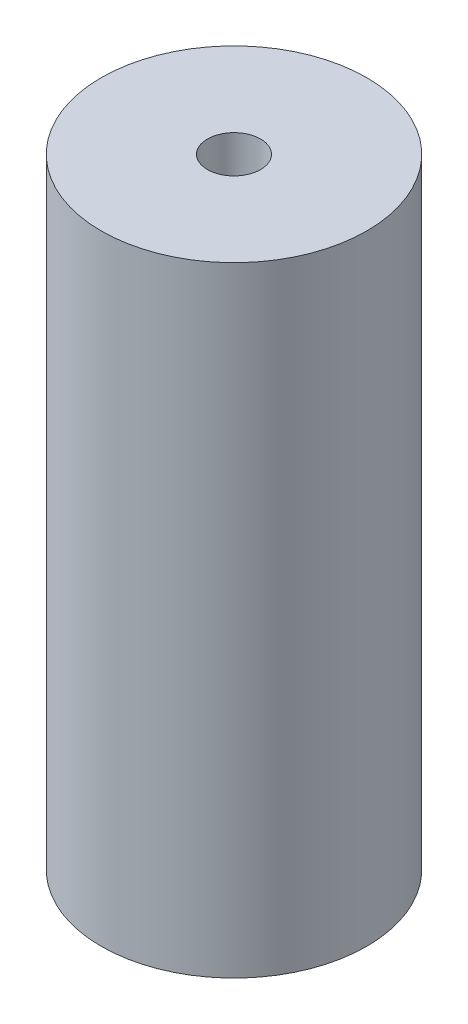
ISO-10303-21;
HEADER;
FILE_DESCRIPTION(('STEP AP214'),'2;1');
FILE_NAME('part.step','',(''),(''),'','','');
FILE_SCHEMA(('AUTOMOTIVE_DESIGN { 1 0 10303 214 1 1 1 1 }'));
ENDSEC;
DATA;
#1=APPLICATION_CONTEXT('core data for automotive mechanical design processes');
#2=APPLICATION_PROTOCOL_DEFINITION('international standard','automotive_design',2000,#1);
#3=PRODUCT_CONTEXT('',#1,'mechanical');
#4=PRODUCT('Part','Part','',(#3));
#5=PRODUCT_RELATED_PRODUCT_CATEGORY('part','',(#4));
#6=PRODUCT_DEFINITION_FORMATION('','',#4);
#7=PRODUCT_DEFINITION_CONTEXT('part definition',#1,'design');
#8=PRODUCT_DEFINITION('design','',#6,#7);
#9=PRODUCT_DEFINITION_SHAPE('','',#8);
#10=(LENGTH_UNIT() NAMED_UNIT(*) SI_UNIT(.MILLI.,.METRE.));
#11=(NAMED_UNIT(*) PLANE_ANGLE_UNIT() SI_UNIT($,.RADIAN.));
#12=(NAMED_UNIT(*) SI_UNIT($,.STERADIAN.) SOLID_ANGLE_UNIT());
#13=UNCERTAINTY_MEASURE_WITH_UNIT(LENGTH_MEASURE(1.E-05),#10,'distance_accuracy_value','');
#14=(GEOMETRIC_REPRESENTATION_CONTEXT(3) GLOBAL_UNCERTAINTY_ASSIGNED_CONTEXT((#13)) GLOBAL_UNIT_ASSIGNED_CONTEXT((#10,
#11,#12)) REPRESENTATION_CONTEXT('',''));
#15=CARTESIAN_POINT('',(0.,0.,0.));
#16=DIRECTION('',(0.,0.,1.));
#17=DIRECTION('',(1.,0.,0.));
#18=AXIS2_PLACEMENT_3D('',#15,#16,#17);
#19=CARTESIAN_POINT('',(0.,-40.,0.));
#20=DIRECTION('',(0.,-1.,0.));
#21=DIRECTION('',(1.,0.,0.));
#22=AXIS2_PLACEMENT_3D('',#19,#20,#21);
#23=CYLINDRICAL_SURFACE('',#22,3.);
#24=CARTESIAN_POINT('',(0.,0.,0.));
#25=DIRECTION('',(0.,-1.,0.));
#26=DIRECTION('',(1.,0.,0.));
#27=AXIS2_PLACEMENT_3D('',#24,#25,#26);
#28=CIRCLE('',#27,3.);
#29=CARTESIAN_POINT('',(3.,0.,0.));
#30=VERTEX_POINT('',#29);
#31=EDGE_CURVE('E156',#30,#30,#28,.T.);
#32=ORIENTED_EDGE('',*,*,#31,.T.);
#33=EDGE_LOOP('',(#32));
#34=FACE_BOUND('',#33,.T.);
#35=CARTESIAN_POINT('',(0.,30.,0.));
#36=DIRECTION('',(0.,-1.,0.));
#37=DIRECTION('',(1.,0.,0.));
#38=AXIS2_PLACEMENT_3D('',#35,#36,#37);
#39=CIRCLE('',#38,3.);
#40=CARTESIAN_POINT('',(3.,30.,0.));
#41=VERTEX_POINT('',#40);
#42=EDGE_CURVE('E40',#41,#41,#39,.T.);
#43=ORIENTED_EDGE('',*,*,#42,.F.);
#44=EDGE_LOOP('',(#43));
#45=FACE_BOUND('',#44,.T.);
#46=ADVANCED_FACE('F33',(#34,#45),#23,.F.);
#47=CARTESIAN_POINT('',(3.,30.,0.));
#48=DIRECTION('',(0.,1.,0.));
#49=DIRECTION('',(-1.,0.,0.));
#50=AXIS2_PLACEMENT_3D('',#47,#48,#49);
#51=PLANE('',#50);
#52=ORIENTED_EDGE('',*,*,#42,.T.);
#53=EDGE_LOOP('',(#52));
#54=FACE_BOUND('',#53,.T.);
#55=CARTESIAN_POINT('',(0.,30.,0.));
#56=DIRECTION('',(0.,-1.,0.));
#57=DIRECTION('',(1.,0.,0.));
#58=AXIS2_PLACEMENT_3D('',#55,#56,#57);
#59=CIRCLE('',#58,15.);
#60=CARTESIAN_POINT('',(15.,30.,0.));
#61=VERTEX_POINT('',#60);
#62=EDGE_CURVE('E167',#61,#61,#59,.T.);
#63=ORIENTED_EDGE('',*,*,#62,.F.);
#64=EDGE_LOOP('',(#63));
#65=FACE_BOUND('',#64,.T.);
#66=ADVANCED_FACE('F172',(#54,#65),#51,.T.);
#67=CARTESIAN_POINT('',(0.,-40.,0.));
#68=DIRECTION('',(0.,-1.,0.));
#69=DIRECTION('',(1.,0.,0.));
#70=AXIS2_PLACEMENT_3D('',#67,#68,#69);
#71=CYLINDRICAL_SURFACE('',#70,15.);
#72=ORIENTED_EDGE('',*,*,#62,.T.);
#73=EDGE_LOOP('',(#72));
#74=FACE_BOUND('',#73,.T.);
#75=CARTESIAN_POINT('',(0.,-40.,0.));
#76=DIRECTION('',(0.,-1.,0.));
#77=DIRECTION('',(1.,0.,0.));
#78=AXIS2_PLACEMENT_3D('',#75,#76,#77);
#79=CIRCLE('',#78,15.);
#80=CARTESIAN_POINT('',(15.,-40.,0.));
#81=VERTEX_POINT('',#80);
#82=EDGE_CURVE('E164',#81,#81,#79,.T.);
#83=ORIENTED_EDGE('',*,*,#82,.F.);
#84=EDGE_LOOP('',(#83));
#85=FACE_BOUND('',#84,.T.);
#86=ADVANCED_FACE('F180',(#74,#85),#71,.T.);
#87=CARTESIAN_POINT('',(15.,-40.,0.));
#88=DIRECTION('',(0.,-1.,0.));
#89=DIRECTION('',(1.,0.,0.));
#90=AXIS2_PLACEMENT_3D('',#87,#88,#89);
#91=PLANE('',#90);
#92=DIRECTION('',(-1.,0.,0.));
#93=VECTOR('',#92,1.);
#94=CARTESIAN_POINT('',(-2.5,-40.,12.1824583655185));
#95=LINE('',#94,#93);
#96=CARTESIAN_POINT('',(2.5,-40.,12.1824583655185));
#97=VERTEX_POINT('',#96);
#98=CARTESIAN_POINT('',(-2.5,-40.,12.1824583655185));
#99=VERTEX_POINT('',#98);
#100=EDGE_CURVE('E139',#97,#99,#95,.T.);
#101=ORIENTED_EDGE('',*,*,#100,.F.);
#102=DIRECTION('',(0.,0.,1.));
#103=VECTOR('',#102,1.);
#104=CARTESIAN_POINT('',(2.5,-40.,12.1824583655185));
#105=LINE('',#104,#103);
#106=CARTESIAN_POINT('',(2.5,-40.,9.68245836551854));
#107=VERTEX_POINT('',#106);
#108=EDGE_CURVE('E142',#107,#97,#105,.T.);
#109=ORIENTED_EDGE('',*,*,#108,.F.);
#110=CARTESIAN_POINT('',(0.,-40.,0.));
#111=DIRECTION('',(0.,-1.,0.));
#112=DIRECTION('',(1.,0.,0.));
#113=AXIS2_PLACEMENT_3D('',#110,#111,#112);
#114=CIRCLE('',#113,10.);
#115=CARTESIAN_POINT('',(-2.5,-40.,9.68245836551854));
#116=VERTEX_POINT('',#115);
#117=EDGE_CURVE('E149',#116,#107,#114,.T.);
#118=ORIENTED_EDGE('',*,*,#117,.F.);
#119=DIRECTION('',(0.,0.,-1.));
#120=VECTOR('',#119,1.);
#121=CARTESIAN_POINT('',(-2.5,-40.,12.1824583655185));
#122=LINE('',#121,#120);
#123=EDGE_CURVE('E147',#99,#116,#122,.T.);
#124=ORIENTED_EDGE('',*,*,#123,.F.);
#125=EDGE_LOOP('',(#101,#109,#118,#124));
#126=FACE_BOUND('',#125,.T.);
#127=ORIENTED_EDGE('',*,*,#82,.T.);
#128=EDGE_LOOP('',(#127));
#129=FACE_BOUND('',#128,.T.);
#130=ADVANCED_FACE('F186',(#126,#129),#91,.T.);
#131=CARTESIAN_POINT('',(0.,0.,0.));
#132=DIRECTION('',(0.,1.,0.));
#133=DIRECTION('',(-1.,0.,0.));
#134=AXIS2_PLACEMENT_3D('',#131,#132,#133);
#135=PLANE('',#134);
#136=ORIENTED_EDGE('',*,*,#31,.F.);
#137=EDGE_LOOP('',(#136));
#138=FACE_BOUND('',#137,.T.);
#139=ADVANCED_FACE('F183',(#138),#135,.T.);
#140=CARTESIAN_POINT('',(-2.5,-10.,12.1824583655185));
#141=DIRECTION('',(0.,0.,1.));
#142=DIRECTION('',(1.,0.,0.));
#143=AXIS2_PLACEMENT_3D('',#140,#141,#142);
#144=PLANE('',#143);
#145=DIRECTION('',(0.,-1.,0.));
#146=VECTOR('',#145,1.);
#147=CARTESIAN_POINT('',(-2.5,-10.,12.1824583655185));
#148=LINE('',#147,#146);
#149=CARTESIAN_POINT('',(-2.5,-15.,12.1824583655185));
#150=VERTEX_POINT('',#149);
#151=EDGE_CURVE('E54',#150,#99,#148,.T.);
#152=ORIENTED_EDGE('',*,*,#151,.F.);
#153=DIRECTION('',(1.,0.,0.));
#154=VECTOR('',#153,1.);
#155=CARTESIAN_POINT('',(-2.5,-15.,12.1824583655185));
#156=LINE('',#155,#154);
#157=CARTESIAN_POINT('',(0.,-15.,12.1824583655185));
#158=VERTEX_POINT('',#157);
#159=EDGE_CURVE('E136',#150,#158,#156,.T.);
#160=ORIENTED_EDGE('',*,*,#159,.T.);
#161=DIRECTION('',(0.,-1.,0.));
#162=VECTOR('',#161,1.);
#163=CARTESIAN_POINT('',(0.,-10.,12.1824583655185));
#164=LINE('',#163,#162);
#165=CARTESIAN_POINT('',(0.,-10.,12.1824583655185));
#166=VERTEX_POINT('',#165);
#167=EDGE_CURVE('E134',#166,#158,#164,.T.);
#168=ORIENTED_EDGE('',*,*,#167,.F.);
#169=DIRECTION('',(-1.,0.,0.));
#170=VECTOR('',#169,1.);
#171=CARTESIAN_POINT('',(-2.5,-10.,12.1824583655185));
#172=LINE('',#171,#170);
#173=CARTESIAN_POINT('',(2.5,-10.,12.1824583655185));
#174=VERTEX_POINT('',#173);
#175=EDGE_CURVE('E103',#174,#166,#172,.T.);
#176=ORIENTED_EDGE('',*,*,#175,.F.);
#177=DIRECTION('',(0.,-1.,0.));
#178=VECTOR('',#177,1.);
#179=CARTESIAN_POINT('',(2.5,-10.,12.1824583655185));
#180=LINE('',#179,#178);
#181=EDGE_CURVE('E154',#174,#97,#180,.T.);
#182=ORIENTED_EDGE('',*,*,#181,.T.);
#183=ORIENTED_EDGE('',*,*,#100,.T.);
#184=EDGE_LOOP('',(#152,#160,#168,#176,#182,#183));
#185=FACE_BOUND('',#184,.T.);
#186=ADVANCED_FACE('F185',(#185),#144,.F.);
#187=CARTESIAN_POINT('',(2.5,-10.,12.1824583655185));
#188=DIRECTION('',(1.,0.,0.));
#189=DIRECTION('',(0.,0.,-1.));
#190=AXIS2_PLACEMENT_3D('',#187,#188,#189);
#191=PLANE('',#190);
#192=ORIENTED_EDGE('',*,*,#108,.T.);
#193=ORIENTED_EDGE('',*,*,#181,.F.);
#194=DIRECTION('',(0.,0.,1.));
#195=VECTOR('',#194,1.);
#196=CARTESIAN_POINT('',(2.5,-10.,12.1824583655185));
#197=LINE('',#196,#195);
#198=CARTESIAN_POINT('',(2.5,-10.,9.68245836551854));
#199=VERTEX_POINT('',#198);
#200=EDGE_CURVE('E144',#199,#174,#197,.T.);
#201=ORIENTED_EDGE('',*,*,#200,.F.);
#202=DIRECTION('',(0.,-1.,0.));
#203=VECTOR('',#202,1.);
#204=CARTESIAN_POINT('',(2.5,-10.,9.68245836551854));
#205=LINE('',#204,#203);
#206=EDGE_CURVE('E157',#199,#107,#205,.T.);
#207=ORIENTED_EDGE('',*,*,#206,.T.);
#208=EDGE_LOOP('',(#192,#193,#201,#207));
#209=FACE_BOUND('',#208,.T.);
#210=ADVANCED_FACE('F192',(#209),#191,.F.);
#211=CARTESIAN_POINT('',(0.,-10.,0.));
#212=DIRECTION('',(0.,-1.,0.));
#213=DIRECTION('',(1.,0.,0.));
#214=AXIS2_PLACEMENT_3D('',#211,#212,#213);
#215=CYLINDRICAL_SURFACE('',#214,10.);
#216=DIRECTION('',(0.,1.,0.));
#217=VECTOR('',#216,1.);
#218=CARTESIAN_POINT('',(-7.66044443118979,-10.,6.42787609686538));
#219=LINE('',#218,#217);
#220=CARTESIAN_POINT('',(-7.66044443118979,-15.,6.42787609686538));
#221=VERTEX_POINT('',#220);
#222=CARTESIAN_POINT('',(-7.66044443118979,-10.,6.42787609686538));
#223=VERTEX_POINT('',#222);
#224=EDGE_CURVE('E116',#221,#223,#219,.T.);
#225=ORIENTED_EDGE('',*,*,#224,.F.);
#226=CARTESIAN_POINT('',(0.,-15.,0.));
#227=DIRECTION('',(0.,1.,0.));
#228=DIRECTION('',(0.,0.,1.));
#229=AXIS2_PLACEMENT_3D('',#226,#227,#228);
#230=CIRCLE('',#229,10.);
#231=CARTESIAN_POINT('',(-2.5,-15.,9.68245836551854));
#232=VERTEX_POINT('',#231);
#233=EDGE_CURVE('E131',#221,#232,#230,.T.);
#234=ORIENTED_EDGE('',*,*,#233,.T.);
#235=DIRECTION('',(0.,-1.,0.));
#236=VECTOR('',#235,1.);
#237=CARTESIAN_POINT('',(-2.5,-10.,9.68245836551854));
#238=LINE('',#237,#236);
#239=EDGE_CURVE('E159',#232,#116,#238,.T.);
#240=ORIENTED_EDGE('',*,*,#239,.T.);
#241=ORIENTED_EDGE('',*,*,#117,.T.);
#242=ORIENTED_EDGE('',*,*,#206,.F.);
#243=CARTESIAN_POINT('',(0.,-10.,0.));
#244=DIRECTION('',(0.,-1.,0.));
#245=DIRECTION('',(1.,0.,0.));
#246=AXIS2_PLACEMENT_3D('',#243,#244,#245);
#247=CIRCLE('',#246,10.);
#248=EDGE_CURVE('E141',#223,#199,#247,.T.);
#249=ORIENTED_EDGE('',*,*,#248,.F.);
#250=EDGE_LOOP('',(#225,#234,#240,#241,#242,#249));
#251=FACE_BOUND('',#250,.T.);
#252=ADVANCED_FACE('F224',(#251),#215,.F.);
#253=CARTESIAN_POINT('',(-2.5,-10.,12.1824583655185));
#254=DIRECTION('',(-1.,0.,0.));
#255=DIRECTION('',(0.,0.,1.));
#256=AXIS2_PLACEMENT_3D('',#253,#254,#255);
#257=PLANE('',#256);
#258=ORIENTED_EDGE('',*,*,#239,.F.);
#259=DIRECTION('',(0.,0.,1.));
#260=VECTOR('',#259,1.);
#261=CARTESIAN_POINT('',(-2.5,-15.,12.1824583655185));
#262=LINE('',#261,#260);
#263=EDGE_CURVE('E11',#232,#150,#262,.T.);
#264=ORIENTED_EDGE('',*,*,#263,.T.);
#265=ORIENTED_EDGE('',*,*,#151,.T.);
#266=ORIENTED_EDGE('',*,*,#123,.T.);
#267=EDGE_LOOP('',(#258,#264,#265,#266));
#268=FACE_BOUND('',#267,.T.);
#269=ADVANCED_FACE('F240',(#268),#257,.F.);
#270=CARTESIAN_POINT('',(0.,-10.,0.));
#271=DIRECTION('',(0.,-1.,0.));
#272=DIRECTION('',(1.,0.,0.));
#273=AXIS2_PLACEMENT_3D('',#270,#271,#272);
#274=PLANE('',#273);
#275=ORIENTED_EDGE('',*,*,#175,.T.);
#276=DIRECTION('',(0.,0.,1.));
#277=VECTOR('',#276,1.);
#278=CARTESIAN_POINT('',(0.,-10.,12.5));
#279=LINE('',#278,#277);
#280=CARTESIAN_POINT('',(0.,-10.,12.5));
#281=VERTEX_POINT('',#280);
#282=EDGE_CURVE('E96',#166,#281,#279,.T.);
#283=ORIENTED_EDGE('',*,*,#282,.T.);
#284=CARTESIAN_POINT('',(0.,-10.,0.));
#285=DIRECTION('',(0.,1.,0.));
#286=DIRECTION('',(0.,0.,1.));
#287=AXIS2_PLACEMENT_3D('',#284,#285,#286);
#288=CIRCLE('',#287,12.5);
#289=CARTESIAN_POINT('',(-9.57555553898724,-10.,8.03484512108172));
#290=VERTEX_POINT('',#289);
#291=EDGE_CURVE('E99',#290,#281,#288,.T.);
#292=ORIENTED_EDGE('',*,*,#291,.F.);
#293=DIRECTION('',(-0.766044443118979,0.,0.642787609686538));
#294=VECTOR('',#293,1.);
#295=CARTESIAN_POINT('',(-9.57555553898724,-10.,8.03484512108172));
#296=LINE('',#295,#294);
#297=EDGE_CURVE('E47',#223,#290,#296,.T.);
#298=ORIENTED_EDGE('',*,*,#297,.F.);
#299=ORIENTED_EDGE('',*,*,#248,.T.);
#300=ORIENTED_EDGE('',*,*,#200,.T.);
#301=EDGE_LOOP('',(#275,#283,#292,#298,#299,#300));
#302=FACE_BOUND('',#301,.T.);
#303=ADVANCED_FACE('F98',(#302),#274,.T.);
#304=CARTESIAN_POINT('',(-7.66044443118979,-15.,6.42787609686538));
#305=DIRECTION('',(0.,-1.,0.));
#306=DIRECTION('',(0.,0.,-1.));
#307=AXIS2_PLACEMENT_3D('',#304,#305,#306);
#308=PLANE('',#307);
#309=ORIENTED_EDGE('',*,*,#263,.F.);
#310=ORIENTED_EDGE('',*,*,#233,.F.);
#311=DIRECTION('',(0.766044443118979,0.,-0.642787609686538));
#312=VECTOR('',#311,1.);
#313=CARTESIAN_POINT('',(-7.66044443118979,-15.,6.42787609686538));
#314=LINE('',#313,#312);
#315=CARTESIAN_POINT('',(-9.57555553898724,-15.,8.03484512108172));
#316=VERTEX_POINT('',#315);
#317=EDGE_CURVE('E126',#316,#221,#314,.T.);
#318=ORIENTED_EDGE('',*,*,#317,.F.);
#319=CARTESIAN_POINT('',(0.,-15.,0.));
#320=DIRECTION('',(0.,1.,0.));
#321=DIRECTION('',(0.,0.,1.));
#322=AXIS2_PLACEMENT_3D('',#319,#320,#321);
#323=CIRCLE('',#322,12.5);
#324=CARTESIAN_POINT('',(0.,-15.,12.5));
#325=VERTEX_POINT('',#324);
#326=EDGE_CURVE('E115',#316,#325,#323,.T.);
#327=ORIENTED_EDGE('',*,*,#326,.T.);
#328=DIRECTION('',(0.,0.,-1.));
#329=VECTOR('',#328,1.);
#330=CARTESIAN_POINT('',(0.,-15.,10.));
#331=LINE('',#330,#329);
#332=EDGE_CURVE('E120',#325,#158,#331,.T.);
#333=ORIENTED_EDGE('',*,*,#332,.T.);
#334=ORIENTED_EDGE('',*,*,#159,.F.);
#335=EDGE_LOOP('',(#309,#310,#318,#327,#333,#334));
#336=FACE_BOUND('',#335,.T.);
#337=ADVANCED_FACE('F258',(#336),#308,.F.);
#338=CARTESIAN_POINT('',(0.,0.,0.));
#339=DIRECTION('',(-1.,0.,0.));
#340=DIRECTION('',(0.,0.,1.));
#341=AXIS2_PLACEMENT_3D('',#338,#339,#340);
#342=PLANE('',#341);
#343=ORIENTED_EDGE('',*,*,#167,.T.);
#344=ORIENTED_EDGE('',*,*,#332,.F.);
#345=DIRECTION('',(0.,-1.,0.));
#346=VECTOR('',#345,1.);
#347=CARTESIAN_POINT('',(0.,-15.,12.5));
#348=LINE('',#347,#346);
#349=EDGE_CURVE('E107',#281,#325,#348,.T.);
#350=ORIENTED_EDGE('',*,*,#349,.F.);
#351=ORIENTED_EDGE('',*,*,#282,.F.);
#352=EDGE_LOOP('',(#343,#344,#350,#351));
#353=FACE_BOUND('',#352,.T.);
#354=ADVANCED_FACE('F118',(#353),#342,.T.);
#355=CARTESIAN_POINT('',(0.,0.,0.));
#356=DIRECTION('',(0.,1.,0.));
#357=DIRECTION('',(0.,0.,1.));
#358=AXIS2_PLACEMENT_3D('',#355,#356,#357);
#359=CYLINDRICAL_SURFACE('',#358,12.5);
#360=DIRECTION('',(0.,-1.,0.));
#361=VECTOR('',#360,1.);
#362=CARTESIAN_POINT('',(-9.57555553898724,-15.,8.03484512108172));
#363=LINE('',#362,#361);
#364=EDGE_CURVE('E114',#290,#316,#363,.T.);
#365=ORIENTED_EDGE('',*,*,#364,.F.);
#366=ORIENTED_EDGE('',*,*,#291,.T.);
#367=ORIENTED_EDGE('',*,*,#349,.T.);
#368=ORIENTED_EDGE('',*,*,#326,.F.);
#369=EDGE_LOOP('',(#365,#366,#367,#368));
#370=FACE_BOUND('',#369,.T.);
#371=ADVANCED_FACE('F111',(#370),#359,.F.);
#372=CARTESIAN_POINT('',(0.,0.,0.));
#373=DIRECTION('',(-0.642787609686538,0.,-0.766044443118979));
#374=DIRECTION('',(-0.766044443118979,0.,0.642787609686538));
#375=AXIS2_PLACEMENT_3D('',#372,#373,#374);
#376=PLANE('',#375);
#377=ORIENTED_EDGE('',*,*,#297,.T.);
#378=ORIENTED_EDGE('',*,*,#364,.T.);
#379=ORIENTED_EDGE('',*,*,#317,.T.);
#380=ORIENTED_EDGE('',*,*,#224,.T.);
#381=EDGE_LOOP('',(#377,#378,#379,#380));
#382=FACE_BOUND('',#381,.T.);
#383=ADVANCED_FACE('F284',(#382),#376,.F.);
#384=CLOSED_SHELL('',(#46,#66,#86,#130,#139,#186,#210,#252,#269,#303,#337,#354,#371,#383));
#385=MANIFOLD_SOLID_BREP('B2',#384);
#386=ADVANCED_BREP_SHAPE_REPRESENTATION('',(#18,#385),#14);
#387=SHAPE_DEFINITION_REPRESENTATION(#9,#386);
ENDSEC;
END-ISO-10303-21;
